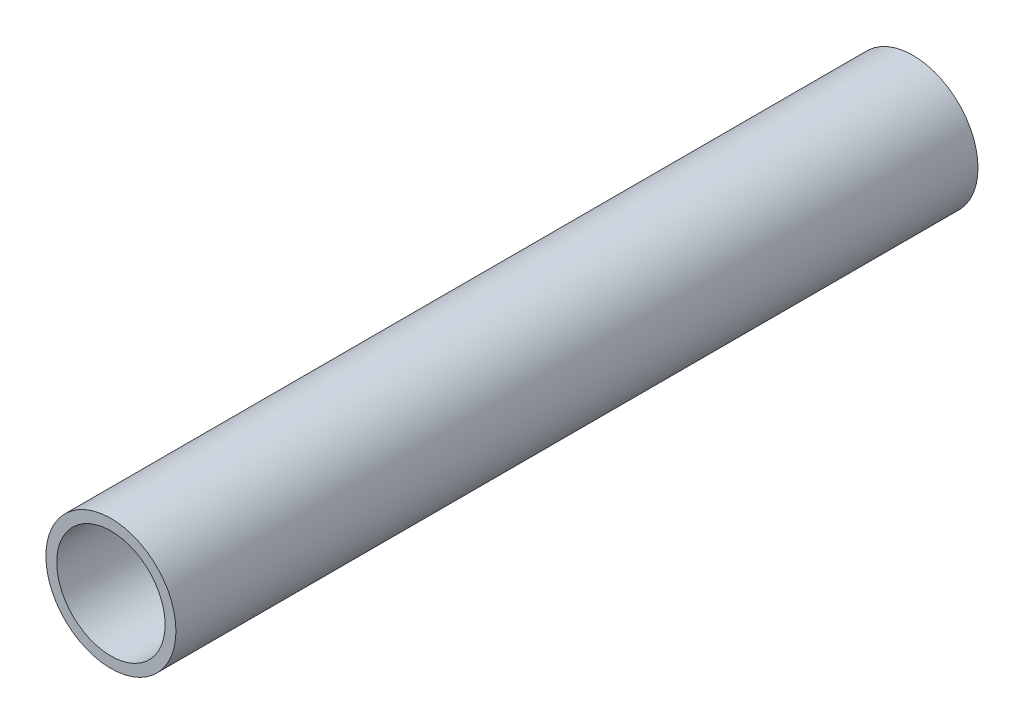
ISO-10303-21;
HEADER;
FILE_DESCRIPTION(('STEP AP214'),'2;1');
FILE_NAME('part.step','',(''),(''),'','','');
FILE_SCHEMA(('AUTOMOTIVE_DESIGN { 1 0 10303 214 1 1 1 1 }'));
ENDSEC;
DATA;
#1=APPLICATION_CONTEXT('core data for automotive mechanical design processes');
#2=APPLICATION_PROTOCOL_DEFINITION('international standard','automotive_design',2000,#1);
#3=PRODUCT_CONTEXT('',#1,'mechanical');
#4=PRODUCT('Part','Part','',(#3));
#5=PRODUCT_RELATED_PRODUCT_CATEGORY('part','',(#4));
#6=PRODUCT_DEFINITION_FORMATION('','',#4);
#7=PRODUCT_DEFINITION_CONTEXT('part definition',#1,'design');
#8=PRODUCT_DEFINITION('design','',#6,#7);
#9=PRODUCT_DEFINITION_SHAPE('','',#8);
#10=(LENGTH_UNIT() NAMED_UNIT(*) SI_UNIT(.MILLI.,.METRE.));
#11=(NAMED_UNIT(*) PLANE_ANGLE_UNIT() SI_UNIT($,.RADIAN.));
#12=(NAMED_UNIT(*) SI_UNIT($,.STERADIAN.) SOLID_ANGLE_UNIT());
#13=UNCERTAINTY_MEASURE_WITH_UNIT(LENGTH_MEASURE(1.E-05),#10,'distance_accuracy_value','');
#14=(GEOMETRIC_REPRESENTATION_CONTEXT(3) GLOBAL_UNCERTAINTY_ASSIGNED_CONTEXT((#13)) GLOBAL_UNIT_ASSIGNED_CONTEXT((#10,
#11,#12)) REPRESENTATION_CONTEXT('',''));
#15=CARTESIAN_POINT('',(0.,0.,0.));
#16=DIRECTION('',(0.,0.,1.));
#17=DIRECTION('',(1.,0.,0.));
#18=AXIS2_PLACEMENT_3D('',#15,#16,#17);
#19=CARTESIAN_POINT('',(0.,0.,234.95));
#20=DIRECTION('',(0.,0.,1.));
#21=DIRECTION('',(1.,0.,0.));
#22=AXIS2_PLACEMENT_3D('',#19,#20,#21);
#23=PLANE('',#22);
#24=CARTESIAN_POINT('',(0.,0.,234.95));
#25=DIRECTION('',(0.,0.,1.));
#26=DIRECTION('',(1.,0.,0.));
#27=AXIS2_PLACEMENT_3D('',#24,#25,#26);
#28=CIRCLE('',#27,19.05);
#29=CARTESIAN_POINT('',(19.05,0.,234.95));
#30=VERTEX_POINT('',#29);
#31=EDGE_CURVE('E10',#30,#30,#28,.T.);
#32=ORIENTED_EDGE('',*,*,#31,.T.);
#33=EDGE_LOOP('',(#32));
#34=FACE_BOUND('',#33,.T.);
#35=CARTESIAN_POINT('',(0.,0.,234.95));
#36=DIRECTION('',(0.,0.,1.));
#37=DIRECTION('',(1.,0.,0.));
#38=AXIS2_PLACEMENT_3D('',#35,#36,#37);
#39=CIRCLE('',#38,15.875);
#40=CARTESIAN_POINT('',(15.875,0.,234.95));
#41=VERTEX_POINT('',#40);
#42=EDGE_CURVE('E50',#41,#41,#39,.T.);
#43=ORIENTED_EDGE('',*,*,#42,.F.);
#44=EDGE_LOOP('',(#43));
#45=FACE_BOUND('',#44,.T.);
#46=ADVANCED_FACE('F37',(#34,#45),#23,.T.);
#47=CARTESIAN_POINT('',(0.,0.,0.));
#48=DIRECTION('',(0.,0.,1.));
#49=DIRECTION('',(1.,0.,0.));
#50=AXIS2_PLACEMENT_3D('',#47,#48,#49);
#51=PLANE('',#50);
#52=CARTESIAN_POINT('',(0.,0.,0.));
#53=DIRECTION('',(0.,0.,1.));
#54=DIRECTION('',(1.,0.,0.));
#55=AXIS2_PLACEMENT_3D('',#52,#53,#54);
#56=CIRCLE('',#55,19.05);
#57=CARTESIAN_POINT('',(19.05,0.,0.));
#58=VERTEX_POINT('',#57);
#59=EDGE_CURVE('E41',#58,#58,#56,.T.);
#60=ORIENTED_EDGE('',*,*,#59,.F.);
#61=EDGE_LOOP('',(#60));
#62=FACE_BOUND('',#61,.T.);
#63=CARTESIAN_POINT('',(0.,0.,0.));
#64=DIRECTION('',(0.,0.,1.));
#65=DIRECTION('',(1.,0.,0.));
#66=AXIS2_PLACEMENT_3D('',#63,#64,#65);
#67=CIRCLE('',#66,15.875);
#68=CARTESIAN_POINT('',(15.875,0.,0.));
#69=VERTEX_POINT('',#68);
#70=EDGE_CURVE('E52',#69,#69,#67,.T.);
#71=ORIENTED_EDGE('',*,*,#70,.T.);
#72=EDGE_LOOP('',(#71));
#73=FACE_BOUND('',#72,.T.);
#74=ADVANCED_FACE('F64',(#62,#73),#51,.F.);
#75=CARTESIAN_POINT('',(0.,0.,234.95));
#76=DIRECTION('',(0.,0.,-1.));
#77=DIRECTION('',(-1.,0.,0.));
#78=AXIS2_PLACEMENT_3D('',#75,#76,#77);
#79=CYLINDRICAL_SURFACE('',#78,19.05);
#80=ORIENTED_EDGE('',*,*,#31,.F.);
#81=EDGE_LOOP('',(#80));
#82=FACE_BOUND('',#81,.T.);
#83=ORIENTED_EDGE('',*,*,#59,.T.);
#84=EDGE_LOOP('',(#83));
#85=FACE_BOUND('',#84,.T.);
#86=ADVANCED_FACE('F39',(#82,#85),#79,.T.);
#87=CARTESIAN_POINT('',(0.,0.,234.95));
#88=DIRECTION('',(0.,0.,-1.));
#89=DIRECTION('',(-1.,0.,0.));
#90=AXIS2_PLACEMENT_3D('',#87,#88,#89);
#91=CYLINDRICAL_SURFACE('',#90,15.875);
#92=ORIENTED_EDGE('',*,*,#42,.T.);
#93=EDGE_LOOP('',(#92));
#94=FACE_BOUND('',#93,.T.);
#95=ORIENTED_EDGE('',*,*,#70,.F.);
#96=EDGE_LOOP('',(#95));
#97=FACE_BOUND('',#96,.T.);
#98=ADVANCED_FACE('F60',(#94,#97),#91,.F.);
#99=CLOSED_SHELL('',(#46,#74,#86,#98));
#100=MANIFOLD_SOLID_BREP('B2',#99);
#101=ADVANCED_BREP_SHAPE_REPRESENTATION('',(#18,#100),#14);
#102=SHAPE_DEFINITION_REPRESENTATION(#9,#101);
ENDSEC;
END-ISO-10303-21;
